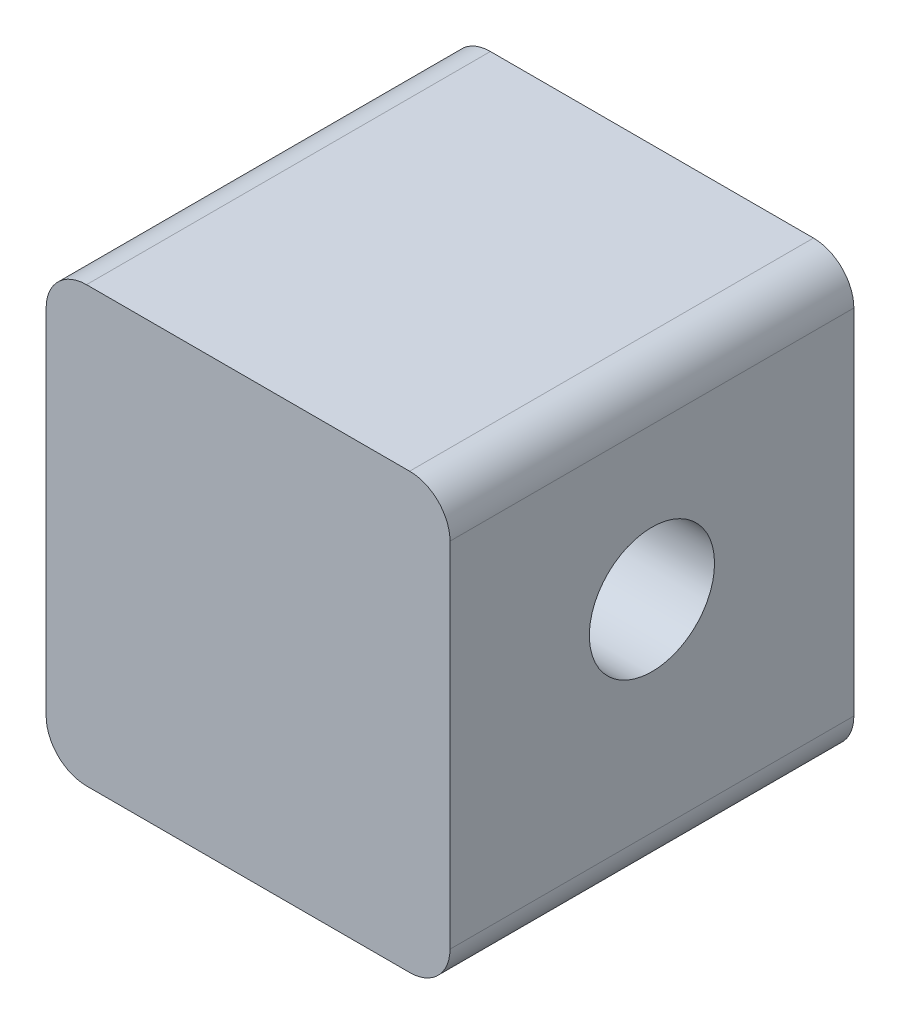
ISO-10303-21;
HEADER;
FILE_DESCRIPTION(('STEP AP214'),'2;1');
FILE_NAME('part.step','',(''),(''),'','','');
FILE_SCHEMA(('AUTOMOTIVE_DESIGN { 1 0 10303 214 1 1 1 1 }'));
ENDSEC;
DATA;
#1=APPLICATION_CONTEXT('core data for automotive mechanical design processes');
#2=APPLICATION_PROTOCOL_DEFINITION('international standard','automotive_design',2000,#1);
#3=PRODUCT_CONTEXT('',#1,'mechanical');
#4=PRODUCT('Part','Part','',(#3));
#5=PRODUCT_RELATED_PRODUCT_CATEGORY('part','',(#4));
#6=PRODUCT_DEFINITION_FORMATION('','',#4);
#7=PRODUCT_DEFINITION_CONTEXT('part definition',#1,'design');
#8=PRODUCT_DEFINITION('design','',#6,#7);
#9=PRODUCT_DEFINITION_SHAPE('','',#8);
#10=(LENGTH_UNIT() NAMED_UNIT(*) SI_UNIT(.MILLI.,.METRE.));
#11=(NAMED_UNIT(*) PLANE_ANGLE_UNIT() SI_UNIT($,.RADIAN.));
#12=(NAMED_UNIT(*) SI_UNIT($,.STERADIAN.) SOLID_ANGLE_UNIT());
#13=UNCERTAINTY_MEASURE_WITH_UNIT(LENGTH_MEASURE(1.E-05),#10,'distance_accuracy_value','');
#14=(GEOMETRIC_REPRESENTATION_CONTEXT(3) GLOBAL_UNCERTAINTY_ASSIGNED_CONTEXT((#13)) GLOBAL_UNIT_ASSIGNED_CONTEXT((#10,
#11,#12)) REPRESENTATION_CONTEXT('',''));
#15=CARTESIAN_POINT('',(0.,0.,0.));
#16=DIRECTION('',(0.,0.,1.));
#17=DIRECTION('',(1.,0.,0.));
#18=AXIS2_PLACEMENT_3D('',#15,#16,#17);
#19=CARTESIAN_POINT('',(-8.,-19.5,10.));
#20=DIRECTION('',(0.,0.,-1.));
#21=DIRECTION('',(-1.,0.,0.));
#22=AXIS2_PLACEMENT_3D('',#19,#20,#21);
#23=CYLINDRICAL_SURFACE('',#22,2.);
#24=CARTESIAN_POINT('',(-8.,-19.5,-10.));
#25=DIRECTION('',(0.,0.,1.));
#26=DIRECTION('',(1.,0.,0.));
#27=AXIS2_PLACEMENT_3D('',#24,#25,#26);
#28=CIRCLE('',#27,2.);
#29=CARTESIAN_POINT('',(-10.,-19.5,-10.));
#30=VERTEX_POINT('',#29);
#31=CARTESIAN_POINT('',(-8.,-21.5,-10.));
#32=VERTEX_POINT('',#31);
#33=EDGE_CURVE('E135',#30,#32,#28,.T.);
#34=ORIENTED_EDGE('',*,*,#33,.T.);
#35=DIRECTION('',(0.,0.,-1.));
#36=VECTOR('',#35,1.);
#37=CARTESIAN_POINT('',(-8.,-21.5,10.));
#38=LINE('',#37,#36);
#39=CARTESIAN_POINT('',(-8.,-21.5,10.));
#40=VERTEX_POINT('',#39);
#41=EDGE_CURVE('E11',#40,#32,#38,.T.);
#42=ORIENTED_EDGE('',*,*,#41,.F.);
#43=CARTESIAN_POINT('',(-8.,-19.5,10.));
#44=DIRECTION('',(0.,0.,1.));
#45=DIRECTION('',(1.,0.,0.));
#46=AXIS2_PLACEMENT_3D('',#43,#44,#45);
#47=CIRCLE('',#46,2.);
#48=CARTESIAN_POINT('',(-10.,-19.5,10.));
#49=VERTEX_POINT('',#48);
#50=EDGE_CURVE('E150',#49,#40,#47,.T.);
#51=ORIENTED_EDGE('',*,*,#50,.F.);
#52=DIRECTION('',(0.,0.,-1.));
#53=VECTOR('',#52,1.);
#54=CARTESIAN_POINT('',(-10.,-19.5,10.));
#55=LINE('',#54,#53);
#56=EDGE_CURVE('E131',#49,#30,#55,.T.);
#57=ORIENTED_EDGE('',*,*,#56,.T.);
#58=EDGE_LOOP('',(#34,#42,#51,#57));
#59=FACE_BOUND('',#58,.T.);
#60=ADVANCED_FACE('F39',(#59),#23,.T.);
#61=CARTESIAN_POINT('',(-8.,-21.5,10.));
#62=DIRECTION('',(0.,1.,0.));
#63=DIRECTION('',(0.,0.,1.));
#64=AXIS2_PLACEMENT_3D('',#61,#62,#63);
#65=PLANE('',#64);
#66=CARTESIAN_POINT('',(0.,-21.5,0.));
#67=DIRECTION('',(0.,1.,0.));
#68=DIRECTION('',(0.,0.,1.));
#69=AXIS2_PLACEMENT_3D('',#66,#67,#68);
#70=CIRCLE('',#69,2.);
#71=CARTESIAN_POINT('',(0.,-21.5,2.));
#72=VERTEX_POINT('',#71);
#73=EDGE_CURVE('E189',#72,#72,#70,.T.);
#74=ORIENTED_EDGE('',*,*,#73,.T.);
#75=EDGE_LOOP('',(#74));
#76=FACE_BOUND('',#75,.T.);
#77=DIRECTION('',(1.,0.,0.));
#78=VECTOR('',#77,1.);
#79=CARTESIAN_POINT('',(-8.,-21.5,-10.));
#80=LINE('',#79,#78);
#81=CARTESIAN_POINT('',(8.,-21.5,-10.));
#82=VERTEX_POINT('',#81);
#83=EDGE_CURVE('E138',#32,#82,#80,.T.);
#84=ORIENTED_EDGE('',*,*,#83,.T.);
#85=DIRECTION('',(0.,0.,-1.));
#86=VECTOR('',#85,1.);
#87=CARTESIAN_POINT('',(8.,-21.5,10.));
#88=LINE('',#87,#86);
#89=CARTESIAN_POINT('',(8.,-21.5,10.));
#90=VERTEX_POINT('',#89);
#91=EDGE_CURVE('E47',#90,#82,#88,.T.);
#92=ORIENTED_EDGE('',*,*,#91,.F.);
#93=DIRECTION('',(1.,0.,0.));
#94=VECTOR('',#93,1.);
#95=CARTESIAN_POINT('',(-8.,-21.5,10.));
#96=LINE('',#95,#94);
#97=EDGE_CURVE('E98',#40,#90,#96,.T.);
#98=ORIENTED_EDGE('',*,*,#97,.F.);
#99=ORIENTED_EDGE('',*,*,#41,.T.);
#100=EDGE_LOOP('',(#84,#92,#98,#99));
#101=FACE_BOUND('',#100,.T.);
#102=ADVANCED_FACE('F207',(#76,#101),#65,.F.);
#103=CARTESIAN_POINT('',(8.,-19.5,10.));
#104=DIRECTION('',(0.,0.,-1.));
#105=DIRECTION('',(-1.,0.,0.));
#106=AXIS2_PLACEMENT_3D('',#103,#104,#105);
#107=CYLINDRICAL_SURFACE('',#106,2.);
#108=CARTESIAN_POINT('',(8.,-19.5,-10.));
#109=DIRECTION('',(0.,0.,1.));
#110=DIRECTION('',(1.,0.,0.));
#111=AXIS2_PLACEMENT_3D('',#108,#109,#110);
#112=CIRCLE('',#111,2.);
#113=CARTESIAN_POINT('',(10.,-19.5,-10.));
#114=VERTEX_POINT('',#113);
#115=EDGE_CURVE('E141',#82,#114,#112,.T.);
#116=ORIENTED_EDGE('',*,*,#115,.T.);
#117=DIRECTION('',(0.,0.,-1.));
#118=VECTOR('',#117,1.);
#119=CARTESIAN_POINT('',(10.,-19.5,10.));
#120=LINE('',#119,#118);
#121=CARTESIAN_POINT('',(10.,-19.5,10.));
#122=VERTEX_POINT('',#121);
#123=EDGE_CURVE('E157',#122,#114,#120,.T.);
#124=ORIENTED_EDGE('',*,*,#123,.F.);
#125=CARTESIAN_POINT('',(8.,-19.5,10.));
#126=DIRECTION('',(0.,0.,1.));
#127=DIRECTION('',(1.,0.,0.));
#128=AXIS2_PLACEMENT_3D('',#125,#126,#127);
#129=CIRCLE('',#128,2.);
#130=EDGE_CURVE('E165',#90,#122,#129,.T.);
#131=ORIENTED_EDGE('',*,*,#130,.F.);
#132=ORIENTED_EDGE('',*,*,#91,.T.);
#133=EDGE_LOOP('',(#116,#124,#131,#132));
#134=FACE_BOUND('',#133,.T.);
#135=ADVANCED_FACE('F163',(#134),#107,.T.);
#136=CARTESIAN_POINT('',(10.,-19.5,10.));
#137=DIRECTION('',(-1.,0.,0.));
#138=DIRECTION('',(0.,0.,1.));
#139=AXIS2_PLACEMENT_3D('',#136,#137,#138);
#140=PLANE('',#139);
#141=CARTESIAN_POINT('',(10.,-9.5,0.));
#142=DIRECTION('',(1.,0.,0.));
#143=DIRECTION('',(0.,0.,-1.));
#144=AXIS2_PLACEMENT_3D('',#141,#142,#143);
#145=CIRCLE('',#144,3.1);
#146=CARTESIAN_POINT('',(10.,-9.5,-3.1));
#147=VERTEX_POINT('',#146);
#148=EDGE_CURVE('E185',#147,#147,#145,.T.);
#149=ORIENTED_EDGE('',*,*,#148,.F.);
#150=EDGE_LOOP('',(#149));
#151=FACE_BOUND('',#150,.T.);
#152=DIRECTION('',(0.,1.,0.));
#153=VECTOR('',#152,1.);
#154=CARTESIAN_POINT('',(10.,-19.5,-10.));
#155=LINE('',#154,#153);
#156=CARTESIAN_POINT('',(10.,-2.,-10.));
#157=VERTEX_POINT('',#156);
#158=EDGE_CURVE('E143',#114,#157,#155,.T.);
#159=ORIENTED_EDGE('',*,*,#158,.T.);
#160=DIRECTION('',(0.,0.,-1.));
#161=VECTOR('',#160,1.);
#162=CARTESIAN_POINT('',(10.,-2.,10.));
#163=LINE('',#162,#161);
#164=CARTESIAN_POINT('',(10.,-2.,10.));
#165=VERTEX_POINT('',#164);
#166=EDGE_CURVE('E154',#165,#157,#163,.T.);
#167=ORIENTED_EDGE('',*,*,#166,.F.);
#168=DIRECTION('',(0.,1.,0.));
#169=VECTOR('',#168,1.);
#170=CARTESIAN_POINT('',(10.,-19.5,10.));
#171=LINE('',#170,#169);
#172=EDGE_CURVE('E177',#122,#165,#171,.T.);
#173=ORIENTED_EDGE('',*,*,#172,.F.);
#174=ORIENTED_EDGE('',*,*,#123,.T.);
#175=EDGE_LOOP('',(#159,#167,#173,#174));
#176=FACE_BOUND('',#175,.T.);
#177=ADVANCED_FACE('F173',(#151,#176),#140,.F.);
#178=CARTESIAN_POINT('',(8.,-2.,10.));
#179=DIRECTION('',(0.,0.,-1.));
#180=DIRECTION('',(-1.,0.,0.));
#181=AXIS2_PLACEMENT_3D('',#178,#179,#180);
#182=CYLINDRICAL_SURFACE('',#181,2.);
#183=CARTESIAN_POINT('',(8.,-2.,-10.));
#184=DIRECTION('',(0.,0.,1.));
#185=DIRECTION('',(1.,0.,0.));
#186=AXIS2_PLACEMENT_3D('',#183,#184,#185);
#187=CIRCLE('',#186,2.);
#188=CARTESIAN_POINT('',(8.,0.,-10.));
#189=VERTEX_POINT('',#188);
#190=EDGE_CURVE('E145',#157,#189,#187,.T.);
#191=ORIENTED_EDGE('',*,*,#190,.T.);
#192=DIRECTION('',(0.,0.,-1.));
#193=VECTOR('',#192,1.);
#194=CARTESIAN_POINT('',(8.,0.,10.));
#195=LINE('',#194,#193);
#196=CARTESIAN_POINT('',(8.,0.,10.));
#197=VERTEX_POINT('',#196);
#198=EDGE_CURVE('E126',#197,#189,#195,.T.);
#199=ORIENTED_EDGE('',*,*,#198,.F.);
#200=CARTESIAN_POINT('',(8.,-2.,10.));
#201=DIRECTION('',(0.,0.,1.));
#202=DIRECTION('',(1.,0.,0.));
#203=AXIS2_PLACEMENT_3D('',#200,#201,#202);
#204=CIRCLE('',#203,2.);
#205=EDGE_CURVE('E117',#165,#197,#204,.T.);
#206=ORIENTED_EDGE('',*,*,#205,.F.);
#207=ORIENTED_EDGE('',*,*,#166,.T.);
#208=EDGE_LOOP('',(#191,#199,#206,#207));
#209=FACE_BOUND('',#208,.T.);
#210=ADVANCED_FACE('F176',(#209),#182,.T.);
#211=CARTESIAN_POINT('',(8.,0.,10.));
#212=DIRECTION('',(0.,-1.,0.));
#213=DIRECTION('',(0.,0.,-1.));
#214=AXIS2_PLACEMENT_3D('',#211,#212,#213);
#215=PLANE('',#214);
#216=DIRECTION('',(-1.,0.,0.));
#217=VECTOR('',#216,1.);
#218=CARTESIAN_POINT('',(8.,0.,-10.));
#219=LINE('',#218,#217);
#220=CARTESIAN_POINT('',(-8.,0.,-10.));
#221=VERTEX_POINT('',#220);
#222=EDGE_CURVE('E125',#189,#221,#219,.T.);
#223=ORIENTED_EDGE('',*,*,#222,.T.);
#224=DIRECTION('',(0.,0.,-1.));
#225=VECTOR('',#224,1.);
#226=CARTESIAN_POINT('',(-8.,0.,10.));
#227=LINE('',#226,#225);
#228=CARTESIAN_POINT('',(-8.,0.,10.));
#229=VERTEX_POINT('',#228);
#230=EDGE_CURVE('E122',#229,#221,#227,.T.);
#231=ORIENTED_EDGE('',*,*,#230,.F.);
#232=DIRECTION('',(-1.,0.,0.));
#233=VECTOR('',#232,1.);
#234=CARTESIAN_POINT('',(8.,0.,10.));
#235=LINE('',#234,#233);
#236=EDGE_CURVE('E111',#197,#229,#235,.T.);
#237=ORIENTED_EDGE('',*,*,#236,.F.);
#238=ORIENTED_EDGE('',*,*,#198,.T.);
#239=EDGE_LOOP('',(#223,#231,#237,#238));
#240=FACE_BOUND('',#239,.T.);
#241=ADVANCED_FACE('F123',(#240),#215,.F.);
#242=CARTESIAN_POINT('',(-8.,-2.,10.));
#243=DIRECTION('',(0.,0.,-1.));
#244=DIRECTION('',(-1.,0.,0.));
#245=AXIS2_PLACEMENT_3D('',#242,#243,#244);
#246=CYLINDRICAL_SURFACE('',#245,2.);
#247=CARTESIAN_POINT('',(-8.,-2.,-10.));
#248=DIRECTION('',(0.,0.,1.));
#249=DIRECTION('',(1.,0.,0.));
#250=AXIS2_PLACEMENT_3D('',#247,#248,#249);
#251=CIRCLE('',#250,2.);
#252=CARTESIAN_POINT('',(-10.,-2.,-10.));
#253=VERTEX_POINT('',#252);
#254=EDGE_CURVE('E84',#221,#253,#251,.T.);
#255=ORIENTED_EDGE('',*,*,#254,.T.);
#256=DIRECTION('',(0.,0.,-1.));
#257=VECTOR('',#256,1.);
#258=CARTESIAN_POINT('',(-10.,-2.,10.));
#259=LINE('',#258,#257);
#260=CARTESIAN_POINT('',(-10.,-2.,10.));
#261=VERTEX_POINT('',#260);
#262=EDGE_CURVE('E127',#261,#253,#259,.T.);
#263=ORIENTED_EDGE('',*,*,#262,.F.);
#264=CARTESIAN_POINT('',(-8.,-2.,10.));
#265=DIRECTION('',(0.,0.,1.));
#266=DIRECTION('',(1.,0.,0.));
#267=AXIS2_PLACEMENT_3D('',#264,#265,#266);
#268=CIRCLE('',#267,2.);
#269=EDGE_CURVE('E115',#229,#261,#268,.T.);
#270=ORIENTED_EDGE('',*,*,#269,.F.);
#271=ORIENTED_EDGE('',*,*,#230,.T.);
#272=EDGE_LOOP('',(#255,#263,#270,#271));
#273=FACE_BOUND('',#272,.T.);
#274=ADVANCED_FACE('F129',(#273),#246,.T.);
#275=CARTESIAN_POINT('',(-10.,-2.,10.));
#276=DIRECTION('',(1.,0.,0.));
#277=DIRECTION('',(0.,0.,-1.));
#278=AXIS2_PLACEMENT_3D('',#275,#276,#277);
#279=PLANE('',#278);
#280=CARTESIAN_POINT('',(-10.,-9.5,0.));
#281=DIRECTION('',(1.,0.,0.));
#282=DIRECTION('',(0.,0.,-1.));
#283=AXIS2_PLACEMENT_3D('',#280,#281,#282);
#284=CIRCLE('',#283,3.1);
#285=CARTESIAN_POINT('',(-10.,-9.5,-3.1));
#286=VERTEX_POINT('',#285);
#287=EDGE_CURVE('E139',#286,#286,#284,.T.);
#288=ORIENTED_EDGE('',*,*,#287,.T.);
#289=EDGE_LOOP('',(#288));
#290=FACE_BOUND('',#289,.T.);
#291=DIRECTION('',(0.,-1.,0.));
#292=VECTOR('',#291,1.);
#293=CARTESIAN_POINT('',(-10.,-2.,-10.));
#294=LINE('',#293,#292);
#295=EDGE_CURVE('E90',#253,#30,#294,.T.);
#296=ORIENTED_EDGE('',*,*,#295,.T.);
#297=ORIENTED_EDGE('',*,*,#56,.F.);
#298=DIRECTION('',(0.,-1.,0.));
#299=VECTOR('',#298,1.);
#300=CARTESIAN_POINT('',(-10.,-2.,10.));
#301=LINE('',#300,#299);
#302=EDGE_CURVE('E55',#261,#49,#301,.T.);
#303=ORIENTED_EDGE('',*,*,#302,.F.);
#304=ORIENTED_EDGE('',*,*,#262,.T.);
#305=EDGE_LOOP('',(#296,#297,#303,#304));
#306=FACE_BOUND('',#305,.T.);
#307=ADVANCED_FACE('F216',(#290,#306),#279,.F.);
#308=CARTESIAN_POINT('',(-8.,-19.5,10.));
#309=DIRECTION('',(0.,0.,1.));
#310=DIRECTION('',(1.,0.,0.));
#311=AXIS2_PLACEMENT_3D('',#308,#309,#310);
#312=PLANE('',#311);
#313=ORIENTED_EDGE('',*,*,#50,.T.);
#314=ORIENTED_EDGE('',*,*,#97,.T.);
#315=ORIENTED_EDGE('',*,*,#130,.T.);
#316=ORIENTED_EDGE('',*,*,#172,.T.);
#317=ORIENTED_EDGE('',*,*,#205,.T.);
#318=ORIENTED_EDGE('',*,*,#236,.T.);
#319=ORIENTED_EDGE('',*,*,#269,.T.);
#320=ORIENTED_EDGE('',*,*,#302,.T.);
#321=EDGE_LOOP('',(#313,#314,#315,#316,#317,#318,#319,#320));
#322=FACE_BOUND('',#321,.T.);
#323=ADVANCED_FACE('F113',(#322),#312,.T.);
#324=CARTESIAN_POINT('',(-8.,-19.5,-10.));
#325=DIRECTION('',(0.,0.,1.));
#326=DIRECTION('',(1.,0.,0.));
#327=AXIS2_PLACEMENT_3D('',#324,#325,#326);
#328=PLANE('',#327);
#329=ORIENTED_EDGE('',*,*,#33,.F.);
#330=ORIENTED_EDGE('',*,*,#295,.F.);
#331=ORIENTED_EDGE('',*,*,#254,.F.);
#332=ORIENTED_EDGE('',*,*,#222,.F.);
#333=ORIENTED_EDGE('',*,*,#190,.F.);
#334=ORIENTED_EDGE('',*,*,#158,.F.);
#335=ORIENTED_EDGE('',*,*,#115,.F.);
#336=ORIENTED_EDGE('',*,*,#83,.F.);
#337=EDGE_LOOP('',(#329,#330,#331,#332,#333,#334,#335,#336));
#338=FACE_BOUND('',#337,.T.);
#339=ADVANCED_FACE('F169',(#338),#328,.F.);
#340=CARTESIAN_POINT('',(-10.,-9.5,0.));
#341=DIRECTION('',(1.,0.,0.));
#342=DIRECTION('',(0.,0.,-1.));
#343=AXIS2_PLACEMENT_3D('',#340,#341,#342);
#344=CYLINDRICAL_SURFACE('',#343,3.1);
#345=ORIENTED_EDGE('',*,*,#287,.F.);
#346=EDGE_LOOP('',(#345));
#347=FACE_BOUND('',#346,.T.);
#348=ORIENTED_EDGE('',*,*,#148,.T.);
#349=EDGE_LOOP('',(#348));
#350=FACE_BOUND('',#349,.T.);
#351=ADVANCED_FACE('F204',(#347,#350),#344,.F.);
#352=CARTESIAN_POINT('',(0.,-13.,0.));
#353=DIRECTION('',(0.,-1.,0.));
#354=DIRECTION('',(0.,0.,-1.));
#355=AXIS2_PLACEMENT_3D('',#352,#353,#354);
#356=CYLINDRICAL_SURFACE('',#355,2.);
#357=CARTESIAN_POINT('',(0.,-13.,0.));
#358=DIRECTION('',(0.,1.,0.));
#359=DIRECTION('',(0.,0.,1.));
#360=AXIS2_PLACEMENT_3D('',#357,#358,#359);
#361=CIRCLE('',#360,2.);
#362=CARTESIAN_POINT('',(0.,-13.,2.));
#363=VERTEX_POINT('',#362);
#364=EDGE_CURVE('E188',#363,#363,#361,.T.);
#365=ORIENTED_EDGE('',*,*,#364,.T.);
#366=EDGE_LOOP('',(#365));
#367=FACE_BOUND('',#366,.T.);
#368=ORIENTED_EDGE('',*,*,#73,.F.);
#369=EDGE_LOOP('',(#368));
#370=FACE_BOUND('',#369,.T.);
#371=ADVANCED_FACE('F195',(#367,#370),#356,.F.);
#372=CARTESIAN_POINT('',(0.,-13.,0.));
#373=DIRECTION('',(0.,1.,0.));
#374=DIRECTION('',(0.,0.,1.));
#375=AXIS2_PLACEMENT_3D('',#372,#373,#374);
#376=PLANE('',#375);
#377=ORIENTED_EDGE('',*,*,#364,.F.);
#378=EDGE_LOOP('',(#377));
#379=FACE_BOUND('',#378,.T.);
#380=ADVANCED_FACE('F198',(#379),#376,.F.);
#381=CLOSED_SHELL('',(#60,#102,#135,#177,#210,#241,#274,#307,#323,#339,#351,#371,#380));
#382=MANIFOLD_SOLID_BREP('B2',#381);
#383=ADVANCED_BREP_SHAPE_REPRESENTATION('',(#18,#382),#14);
#384=SHAPE_DEFINITION_REPRESENTATION(#9,#383);
ENDSEC;
END-ISO-10303-21;
